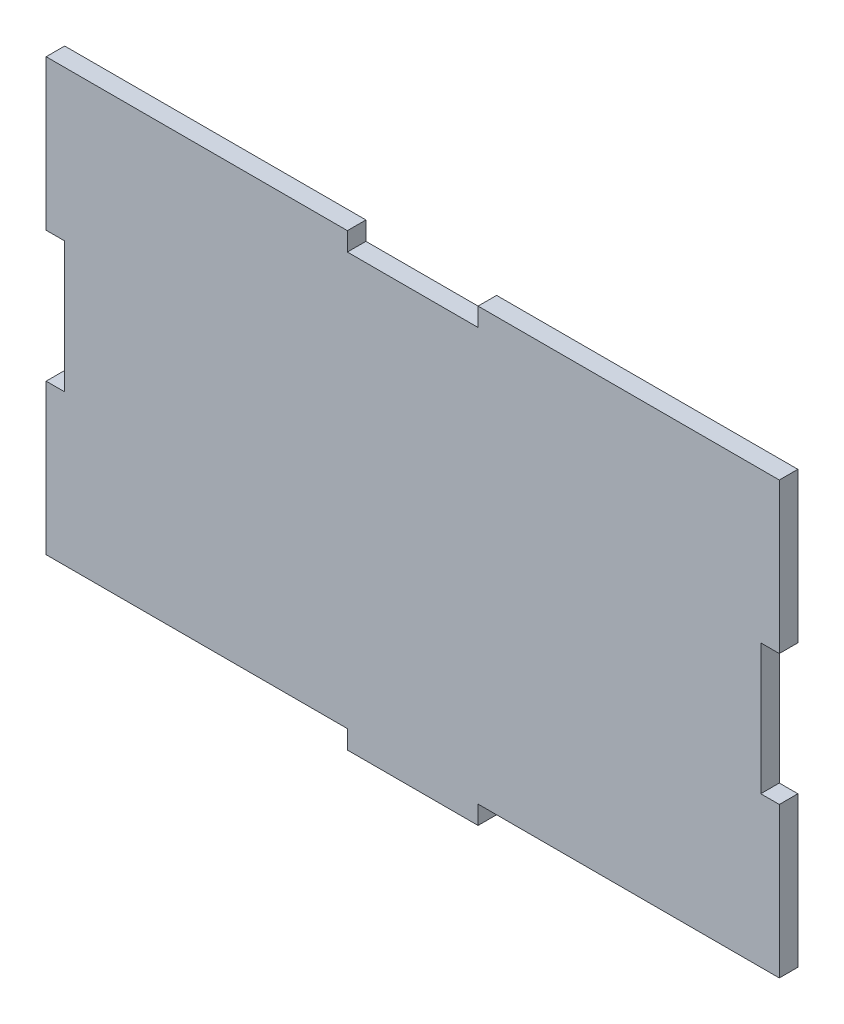
ISO-10303-21;
HEADER;
FILE_DESCRIPTION(('STEP AP214'),'2;1');
FILE_NAME('part.step','',(''),(''),'','','');
FILE_SCHEMA(('AUTOMOTIVE_DESIGN { 1 0 10303 214 1 1 1 1 }'));
ENDSEC;
DATA;
#1=APPLICATION_CONTEXT('core data for automotive mechanical design processes');
#2=APPLICATION_PROTOCOL_DEFINITION('international standard','automotive_design',2000,#1);
#3=PRODUCT_CONTEXT('',#1,'mechanical');
#4=PRODUCT('Part','Part','',(#3));
#5=PRODUCT_RELATED_PRODUCT_CATEGORY('part','',(#4));
#6=PRODUCT_DEFINITION_FORMATION('','',#4);
#7=PRODUCT_DEFINITION_CONTEXT('part definition',#1,'design');
#8=PRODUCT_DEFINITION('design','',#6,#7);
#9=PRODUCT_DEFINITION_SHAPE('','',#8);
#10=(LENGTH_UNIT() NAMED_UNIT(*) SI_UNIT(.MILLI.,.METRE.));
#11=(NAMED_UNIT(*) PLANE_ANGLE_UNIT() SI_UNIT($,.RADIAN.));
#12=(NAMED_UNIT(*) SI_UNIT($,.STERADIAN.) SOLID_ANGLE_UNIT());
#13=UNCERTAINTY_MEASURE_WITH_UNIT(LENGTH_MEASURE(1.E-05),#10,'distance_accuracy_value','');
#14=(GEOMETRIC_REPRESENTATION_CONTEXT(3) GLOBAL_UNCERTAINTY_ASSIGNED_CONTEXT((#13)) GLOBAL_UNIT_ASSIGNED_CONTEXT((#10,
#11,#12)) REPRESENTATION_CONTEXT('',''));
#15=CARTESIAN_POINT('',(0.,0.,0.));
#16=DIRECTION('',(0.,0.,1.));
#17=DIRECTION('',(1.,0.,0.));
#18=AXIS2_PLACEMENT_3D('',#15,#16,#17);
#19=CARTESIAN_POINT('',(85.,15.15,4.3));
#20=DIRECTION('',(-1.,0.,0.));
#21=DIRECTION('',(0.,-1.,0.));
#22=AXIS2_PLACEMENT_3D('',#19,#20,#21);
#23=PLANE('',#22);
#24=DIRECTION('',(0.,1.,0.));
#25=VECTOR('',#24,1.);
#26=CARTESIAN_POINT('',(85.,15.15,0.));
#27=LINE('',#26,#25);
#28=CARTESIAN_POINT('',(85.,15.15,0.));
#29=VERTEX_POINT('',#28);
#30=CARTESIAN_POINT('',(85.,50.,0.));
#31=VERTEX_POINT('',#30);
#32=EDGE_CURVE('E204',#29,#31,#27,.T.);
#33=ORIENTED_EDGE('',*,*,#32,.T.);
#34=DIRECTION('',(0.,0.,-1.));
#35=VECTOR('',#34,1.);
#36=CARTESIAN_POINT('',(85.,50.,4.3));
#37=LINE('',#36,#35);
#38=CARTESIAN_POINT('',(85.,50.,4.3));
#39=VERTEX_POINT('',#38);
#40=EDGE_CURVE('E11',#39,#31,#37,.T.);
#41=ORIENTED_EDGE('',*,*,#40,.F.);
#42=DIRECTION('',(0.,1.,0.));
#43=VECTOR('',#42,1.);
#44=CARTESIAN_POINT('',(85.,15.15,4.3));
#45=LINE('',#44,#43);
#46=CARTESIAN_POINT('',(85.,15.15,4.3));
#47=VERTEX_POINT('',#46);
#48=EDGE_CURVE('E242',#47,#39,#45,.T.);
#49=ORIENTED_EDGE('',*,*,#48,.F.);
#50=DIRECTION('',(0.,0.,-1.));
#51=VECTOR('',#50,1.);
#52=CARTESIAN_POINT('',(85.,15.15,4.3));
#53=LINE('',#52,#51);
#54=EDGE_CURVE('E200',#47,#29,#53,.T.);
#55=ORIENTED_EDGE('',*,*,#54,.T.);
#56=EDGE_LOOP('',(#33,#41,#49,#55));
#57=FACE_BOUND('',#56,.T.);
#58=ADVANCED_FACE('F36',(#57),#23,.F.);
#59=CARTESIAN_POINT('',(15.15,50.,4.3));
#60=DIRECTION('',(0.,-1.,0.));
#61=DIRECTION('',(0.,0.,-1.));
#62=AXIS2_PLACEMENT_3D('',#59,#60,#61);
#63=PLANE('',#62);
#64=DIRECTION('',(-1.,0.,0.));
#65=VECTOR('',#64,1.);
#66=CARTESIAN_POINT('',(15.15,50.,0.));
#67=LINE('',#66,#65);
#68=CARTESIAN_POINT('',(15.15,50.,0.));
#69=VERTEX_POINT('',#68);
#70=EDGE_CURVE('E207',#31,#69,#67,.T.);
#71=ORIENTED_EDGE('',*,*,#70,.T.);
#72=DIRECTION('',(0.,0.,-1.));
#73=VECTOR('',#72,1.);
#74=CARTESIAN_POINT('',(15.15,50.,4.3));
#75=LINE('',#74,#73);
#76=CARTESIAN_POINT('',(15.15,50.,4.3));
#77=VERTEX_POINT('',#76);
#78=EDGE_CURVE('E44',#77,#69,#75,.T.);
#79=ORIENTED_EDGE('',*,*,#78,.F.);
#80=DIRECTION('',(-1.,0.,0.));
#81=VECTOR('',#80,1.);
#82=CARTESIAN_POINT('',(15.15,50.,4.3));
#83=LINE('',#82,#81);
#84=EDGE_CURVE('E131',#39,#77,#83,.T.);
#85=ORIENTED_EDGE('',*,*,#84,.F.);
#86=ORIENTED_EDGE('',*,*,#40,.T.);
#87=EDGE_LOOP('',(#71,#79,#85,#86));
#88=FACE_BOUND('',#87,.T.);
#89=ADVANCED_FACE('F360',(#88),#63,.F.);
#90=CARTESIAN_POINT('',(15.15,50.,4.3));
#91=DIRECTION('',(1.,0.,0.));
#92=DIRECTION('',(0.,1.,0.));
#93=AXIS2_PLACEMENT_3D('',#90,#91,#92);
#94=PLANE('',#93);
#95=DIRECTION('',(0.,-1.,0.));
#96=VECTOR('',#95,1.);
#97=CARTESIAN_POINT('',(15.15,50.,0.));
#98=LINE('',#97,#96);
#99=CARTESIAN_POINT('',(15.15,45.7,0.));
#100=VERTEX_POINT('',#99);
#101=EDGE_CURVE('E209',#69,#100,#98,.T.);
#102=ORIENTED_EDGE('',*,*,#101,.T.);
#103=DIRECTION('',(0.,0.,-1.));
#104=VECTOR('',#103,1.);
#105=CARTESIAN_POINT('',(15.15,45.7,4.3));
#106=LINE('',#105,#104);
#107=CARTESIAN_POINT('',(15.15,45.7,4.3));
#108=VERTEX_POINT('',#107);
#109=EDGE_CURVE('E285',#108,#100,#106,.T.);
#110=ORIENTED_EDGE('',*,*,#109,.F.);
#111=DIRECTION('',(0.,-1.,0.));
#112=VECTOR('',#111,1.);
#113=CARTESIAN_POINT('',(15.15,50.,4.3));
#114=LINE('',#113,#112);
#115=EDGE_CURVE('E293',#77,#108,#114,.T.);
#116=ORIENTED_EDGE('',*,*,#115,.F.);
#117=ORIENTED_EDGE('',*,*,#78,.T.);
#118=EDGE_LOOP('',(#102,#110,#116,#117));
#119=FACE_BOUND('',#118,.T.);
#120=ADVANCED_FACE('F291',(#119),#94,.F.);
#121=CARTESIAN_POINT('',(-15.15,45.7,4.3));
#122=DIRECTION('',(0.,-1.,0.));
#123=DIRECTION('',(0.,0.,-1.));
#124=AXIS2_PLACEMENT_3D('',#121,#122,#123);
#125=PLANE('',#124);
#126=DIRECTION('',(-1.,0.,0.));
#127=VECTOR('',#126,1.);
#128=CARTESIAN_POINT('',(-15.15,45.7,0.));
#129=LINE('',#128,#127);
#130=CARTESIAN_POINT('',(-15.15,45.7,0.));
#131=VERTEX_POINT('',#130);
#132=EDGE_CURVE('E211',#100,#131,#129,.T.);
#133=ORIENTED_EDGE('',*,*,#132,.T.);
#134=DIRECTION('',(0.,0.,-1.));
#135=VECTOR('',#134,1.);
#136=CARTESIAN_POINT('',(-15.15,45.7,4.3));
#137=LINE('',#136,#135);
#138=CARTESIAN_POINT('',(-15.15,45.7,4.3));
#139=VERTEX_POINT('',#138);
#140=EDGE_CURVE('E282',#139,#131,#137,.T.);
#141=ORIENTED_EDGE('',*,*,#140,.F.);
#142=DIRECTION('',(-1.,0.,0.));
#143=VECTOR('',#142,1.);
#144=CARTESIAN_POINT('',(-15.15,45.7,4.3));
#145=LINE('',#144,#143);
#146=EDGE_CURVE('E311',#108,#139,#145,.T.);
#147=ORIENTED_EDGE('',*,*,#146,.F.);
#148=ORIENTED_EDGE('',*,*,#109,.T.);
#149=EDGE_LOOP('',(#133,#141,#147,#148));
#150=FACE_BOUND('',#149,.T.);
#151=ADVANCED_FACE('F302',(#150),#125,.F.);
#152=CARTESIAN_POINT('',(-15.15,50.,4.3));
#153=DIRECTION('',(-1.,0.,0.));
#154=DIRECTION('',(0.,-1.,0.));
#155=AXIS2_PLACEMENT_3D('',#152,#153,#154);
#156=PLANE('',#155);
#157=DIRECTION('',(0.,1.,0.));
#158=VECTOR('',#157,1.);
#159=CARTESIAN_POINT('',(-15.15,50.,0.));
#160=LINE('',#159,#158);
#161=CARTESIAN_POINT('',(-15.15,50.,0.));
#162=VERTEX_POINT('',#161);
#163=EDGE_CURVE('E213',#131,#162,#160,.T.);
#164=ORIENTED_EDGE('',*,*,#163,.T.);
#165=DIRECTION('',(0.,0.,-1.));
#166=VECTOR('',#165,1.);
#167=CARTESIAN_POINT('',(-15.15,50.,4.3));
#168=LINE('',#167,#166);
#169=CARTESIAN_POINT('',(-15.15,50.,4.3));
#170=VERTEX_POINT('',#169);
#171=EDGE_CURVE('E279',#170,#162,#168,.T.);
#172=ORIENTED_EDGE('',*,*,#171,.F.);
#173=DIRECTION('',(0.,1.,0.));
#174=VECTOR('',#173,1.);
#175=CARTESIAN_POINT('',(-15.15,50.,4.3));
#176=LINE('',#175,#174);
#177=EDGE_CURVE('E308',#139,#170,#176,.T.);
#178=ORIENTED_EDGE('',*,*,#177,.F.);
#179=ORIENTED_EDGE('',*,*,#140,.T.);
#180=EDGE_LOOP('',(#164,#172,#178,#179));
#181=FACE_BOUND('',#180,.T.);
#182=ADVANCED_FACE('F306',(#181),#156,.F.);
#183=CARTESIAN_POINT('',(-85.,50.,4.3));
#184=DIRECTION('',(0.,-1.,0.));
#185=DIRECTION('',(0.,0.,-1.));
#186=AXIS2_PLACEMENT_3D('',#183,#184,#185);
#187=PLANE('',#186);
#188=DIRECTION('',(-1.,0.,0.));
#189=VECTOR('',#188,1.);
#190=CARTESIAN_POINT('',(-85.,50.,0.));
#191=LINE('',#190,#189);
#192=CARTESIAN_POINT('',(-85.,50.,0.));
#193=VERTEX_POINT('',#192);
#194=EDGE_CURVE('E215',#162,#193,#191,.T.);
#195=ORIENTED_EDGE('',*,*,#194,.T.);
#196=DIRECTION('',(0.,0.,-1.));
#197=VECTOR('',#196,1.);
#198=CARTESIAN_POINT('',(-85.,50.,4.3));
#199=LINE('',#198,#197);
#200=CARTESIAN_POINT('',(-85.,50.,4.3));
#201=VERTEX_POINT('',#200);
#202=EDGE_CURVE('E276',#201,#193,#199,.T.);
#203=ORIENTED_EDGE('',*,*,#202,.F.);
#204=DIRECTION('',(-1.,0.,0.));
#205=VECTOR('',#204,1.);
#206=CARTESIAN_POINT('',(-85.,50.,4.3));
#207=LINE('',#206,#205);
#208=EDGE_CURVE('E310',#170,#201,#207,.T.);
#209=ORIENTED_EDGE('',*,*,#208,.F.);
#210=ORIENTED_EDGE('',*,*,#171,.T.);
#211=EDGE_LOOP('',(#195,#203,#209,#210));
#212=FACE_BOUND('',#211,.T.);
#213=ADVANCED_FACE('F373',(#212),#187,.F.);
#214=CARTESIAN_POINT('',(-85.,15.15,4.3));
#215=DIRECTION('',(1.,0.,0.));
#216=DIRECTION('',(0.,1.,0.));
#217=AXIS2_PLACEMENT_3D('',#214,#215,#216);
#218=PLANE('',#217);
#219=DIRECTION('',(0.,-1.,0.));
#220=VECTOR('',#219,1.);
#221=CARTESIAN_POINT('',(-85.,15.15,0.));
#222=LINE('',#221,#220);
#223=CARTESIAN_POINT('',(-85.,15.15,0.));
#224=VERTEX_POINT('',#223);
#225=EDGE_CURVE('E217',#193,#224,#222,.T.);
#226=ORIENTED_EDGE('',*,*,#225,.T.);
#227=DIRECTION('',(0.,0.,-1.));
#228=VECTOR('',#227,1.);
#229=CARTESIAN_POINT('',(-85.,15.15,4.3));
#230=LINE('',#229,#228);
#231=CARTESIAN_POINT('',(-85.,15.15,4.3));
#232=VERTEX_POINT('',#231);
#233=EDGE_CURVE('E273',#232,#224,#230,.T.);
#234=ORIENTED_EDGE('',*,*,#233,.F.);
#235=DIRECTION('',(0.,-1.,0.));
#236=VECTOR('',#235,1.);
#237=CARTESIAN_POINT('',(-85.,15.15,4.3));
#238=LINE('',#237,#236);
#239=EDGE_CURVE('E313',#201,#232,#238,.T.);
#240=ORIENTED_EDGE('',*,*,#239,.F.);
#241=ORIENTED_EDGE('',*,*,#202,.T.);
#242=EDGE_LOOP('',(#226,#234,#240,#241));
#243=FACE_BOUND('',#242,.T.);
#244=ADVANCED_FACE('F376',(#243),#218,.F.);
#245=CARTESIAN_POINT('',(-85.,15.15,4.3));
#246=DIRECTION('',(0.,1.,0.));
#247=DIRECTION('',(0.,0.,1.));
#248=AXIS2_PLACEMENT_3D('',#245,#246,#247);
#249=PLANE('',#248);
#250=DIRECTION('',(1.,0.,0.));
#251=VECTOR('',#250,1.);
#252=CARTESIAN_POINT('',(-85.,15.15,0.));
#253=LINE('',#252,#251);
#254=CARTESIAN_POINT('',(-80.7,15.15,0.));
#255=VERTEX_POINT('',#254);
#256=EDGE_CURVE('E219',#224,#255,#253,.T.);
#257=ORIENTED_EDGE('',*,*,#256,.T.);
#258=DIRECTION('',(0.,0.,-1.));
#259=VECTOR('',#258,1.);
#260=CARTESIAN_POINT('',(-80.7,15.15,4.3));
#261=LINE('',#260,#259);
#262=CARTESIAN_POINT('',(-80.7,15.15,4.3));
#263=VERTEX_POINT('',#262);
#264=EDGE_CURVE('E270',#263,#255,#261,.T.);
#265=ORIENTED_EDGE('',*,*,#264,.F.);
#266=DIRECTION('',(1.,0.,0.));
#267=VECTOR('',#266,1.);
#268=CARTESIAN_POINT('',(-85.,15.15,4.3));
#269=LINE('',#268,#267);
#270=EDGE_CURVE('E319',#232,#263,#269,.T.);
#271=ORIENTED_EDGE('',*,*,#270,.F.);
#272=ORIENTED_EDGE('',*,*,#233,.T.);
#273=EDGE_LOOP('',(#257,#265,#271,#272));
#274=FACE_BOUND('',#273,.T.);
#275=ADVANCED_FACE('F380',(#274),#249,.F.);
#276=CARTESIAN_POINT('',(-80.7,15.15,4.3));
#277=DIRECTION('',(1.,0.,0.));
#278=DIRECTION('',(0.,0.,-1.));
#279=AXIS2_PLACEMENT_3D('',#276,#277,#278);
#280=PLANE('',#279);
#281=DIRECTION('',(0.,-1.,0.));
#282=VECTOR('',#281,1.);
#283=CARTESIAN_POINT('',(-80.7,15.15,0.));
#284=LINE('',#283,#282);
#285=CARTESIAN_POINT('',(-80.7,-15.15,0.));
#286=VERTEX_POINT('',#285);
#287=EDGE_CURVE('E221',#255,#286,#284,.T.);
#288=ORIENTED_EDGE('',*,*,#287,.T.);
#289=DIRECTION('',(0.,0.,-1.));
#290=VECTOR('',#289,1.);
#291=CARTESIAN_POINT('',(-80.7,-15.15,4.3));
#292=LINE('',#291,#290);
#293=CARTESIAN_POINT('',(-80.7,-15.15,4.3));
#294=VERTEX_POINT('',#293);
#295=EDGE_CURVE('E267',#294,#286,#292,.T.);
#296=ORIENTED_EDGE('',*,*,#295,.F.);
#297=DIRECTION('',(0.,-1.,0.));
#298=VECTOR('',#297,1.);
#299=CARTESIAN_POINT('',(-80.7,15.15,4.3));
#300=LINE('',#299,#298);
#301=EDGE_CURVE('E321',#263,#294,#300,.T.);
#302=ORIENTED_EDGE('',*,*,#301,.F.);
#303=ORIENTED_EDGE('',*,*,#264,.T.);
#304=EDGE_LOOP('',(#288,#296,#302,#303));
#305=FACE_BOUND('',#304,.T.);
#306=ADVANCED_FACE('F384',(#305),#280,.F.);
#307=CARTESIAN_POINT('',(-85.,-15.15,4.3));
#308=DIRECTION('',(0.,-1.,0.));
#309=DIRECTION('',(0.,0.,-1.));
#310=AXIS2_PLACEMENT_3D('',#307,#308,#309);
#311=PLANE('',#310);
#312=DIRECTION('',(-1.,0.,0.));
#313=VECTOR('',#312,1.);
#314=CARTESIAN_POINT('',(-85.,-15.15,0.));
#315=LINE('',#314,#313);
#316=CARTESIAN_POINT('',(-85.,-15.15,0.));
#317=VERTEX_POINT('',#316);
#318=EDGE_CURVE('E223',#286,#317,#315,.T.);
#319=ORIENTED_EDGE('',*,*,#318,.T.);
#320=DIRECTION('',(0.,0.,-1.));
#321=VECTOR('',#320,1.);
#322=CARTESIAN_POINT('',(-85.,-15.15,4.3));
#323=LINE('',#322,#321);
#324=CARTESIAN_POINT('',(-85.,-15.15,4.3));
#325=VERTEX_POINT('',#324);
#326=EDGE_CURVE('E264',#325,#317,#323,.T.);
#327=ORIENTED_EDGE('',*,*,#326,.F.);
#328=DIRECTION('',(-1.,0.,0.));
#329=VECTOR('',#328,1.);
#330=CARTESIAN_POINT('',(-85.,-15.15,4.3));
#331=LINE('',#330,#329);
#332=EDGE_CURVE('E323',#294,#325,#331,.T.);
#333=ORIENTED_EDGE('',*,*,#332,.F.);
#334=ORIENTED_EDGE('',*,*,#295,.T.);
#335=EDGE_LOOP('',(#319,#327,#333,#334));
#336=FACE_BOUND('',#335,.T.);
#337=ADVANCED_FACE('F388',(#336),#311,.F.);
#338=CARTESIAN_POINT('',(-85.,-50.,4.3));
#339=DIRECTION('',(1.,0.,0.));
#340=DIRECTION('',(0.,1.,0.));
#341=AXIS2_PLACEMENT_3D('',#338,#339,#340);
#342=PLANE('',#341);
#343=DIRECTION('',(0.,-1.,0.));
#344=VECTOR('',#343,1.);
#345=CARTESIAN_POINT('',(-85.,-50.,0.));
#346=LINE('',#345,#344);
#347=CARTESIAN_POINT('',(-85.,-50.,0.));
#348=VERTEX_POINT('',#347);
#349=EDGE_CURVE('E225',#317,#348,#346,.T.);
#350=ORIENTED_EDGE('',*,*,#349,.T.);
#351=DIRECTION('',(0.,0.,-1.));
#352=VECTOR('',#351,1.);
#353=CARTESIAN_POINT('',(-85.,-50.,4.3));
#354=LINE('',#353,#352);
#355=CARTESIAN_POINT('',(-85.,-50.,4.3));
#356=VERTEX_POINT('',#355);
#357=EDGE_CURVE('E261',#356,#348,#354,.T.);
#358=ORIENTED_EDGE('',*,*,#357,.F.);
#359=DIRECTION('',(0.,-1.,0.));
#360=VECTOR('',#359,1.);
#361=CARTESIAN_POINT('',(-85.,-50.,4.3));
#362=LINE('',#361,#360);
#363=EDGE_CURVE('E325',#325,#356,#362,.T.);
#364=ORIENTED_EDGE('',*,*,#363,.F.);
#365=ORIENTED_EDGE('',*,*,#326,.T.);
#366=EDGE_LOOP('',(#350,#358,#364,#365));
#367=FACE_BOUND('',#366,.T.);
#368=ADVANCED_FACE('F392',(#367),#342,.F.);
#369=CARTESIAN_POINT('',(-85.,-50.,4.3));
#370=DIRECTION('',(0.,1.,0.));
#371=DIRECTION('',(-1.,0.,0.));
#372=AXIS2_PLACEMENT_3D('',#369,#370,#371);
#373=PLANE('',#372);
#374=DIRECTION('',(1.,0.,0.));
#375=VECTOR('',#374,1.);
#376=CARTESIAN_POINT('',(-85.,-50.,0.));
#377=LINE('',#376,#375);
#378=CARTESIAN_POINT('',(-15.15,-50.,0.));
#379=VERTEX_POINT('',#378);
#380=EDGE_CURVE('E227',#348,#379,#377,.T.);
#381=ORIENTED_EDGE('',*,*,#380,.T.);
#382=DIRECTION('',(0.,0.,-1.));
#383=VECTOR('',#382,1.);
#384=CARTESIAN_POINT('',(-15.15,-50.,4.3));
#385=LINE('',#384,#383);
#386=CARTESIAN_POINT('',(-15.15,-50.,4.3));
#387=VERTEX_POINT('',#386);
#388=EDGE_CURVE('E258',#387,#379,#385,.T.);
#389=ORIENTED_EDGE('',*,*,#388,.F.);
#390=DIRECTION('',(1.,0.,0.));
#391=VECTOR('',#390,1.);
#392=CARTESIAN_POINT('',(-85.,-50.,4.3));
#393=LINE('',#392,#391);
#394=EDGE_CURVE('E327',#356,#387,#393,.T.);
#395=ORIENTED_EDGE('',*,*,#394,.F.);
#396=ORIENTED_EDGE('',*,*,#357,.T.);
#397=EDGE_LOOP('',(#381,#389,#395,#396));
#398=FACE_BOUND('',#397,.T.);
#399=ADVANCED_FACE('F396',(#398),#373,.F.);
#400=CARTESIAN_POINT('',(-15.15,-50.,4.3));
#401=DIRECTION('',(1.,0.,0.));
#402=DIRECTION('',(0.,0.,-1.));
#403=AXIS2_PLACEMENT_3D('',#400,#401,#402);
#404=PLANE('',#403);
#405=DIRECTION('',(0.,-1.,0.));
#406=VECTOR('',#405,1.);
#407=CARTESIAN_POINT('',(-15.15,-50.,0.));
#408=LINE('',#407,#406);
#409=CARTESIAN_POINT('',(-15.15,-54.3,0.));
#410=VERTEX_POINT('',#409);
#411=EDGE_CURVE('E229',#379,#410,#408,.T.);
#412=ORIENTED_EDGE('',*,*,#411,.T.);
#413=DIRECTION('',(0.,0.,-1.));
#414=VECTOR('',#413,1.);
#415=CARTESIAN_POINT('',(-15.15,-54.3,4.3));
#416=LINE('',#415,#414);
#417=CARTESIAN_POINT('',(-15.15,-54.3,4.3));
#418=VERTEX_POINT('',#417);
#419=EDGE_CURVE('E255',#418,#410,#416,.T.);
#420=ORIENTED_EDGE('',*,*,#419,.F.);
#421=DIRECTION('',(0.,-1.,0.));
#422=VECTOR('',#421,1.);
#423=CARTESIAN_POINT('',(-15.15,-50.,4.3));
#424=LINE('',#423,#422);
#425=EDGE_CURVE('E329',#387,#418,#424,.T.);
#426=ORIENTED_EDGE('',*,*,#425,.F.);
#427=ORIENTED_EDGE('',*,*,#388,.T.);
#428=EDGE_LOOP('',(#412,#420,#426,#427));
#429=FACE_BOUND('',#428,.T.);
#430=ADVANCED_FACE('F400',(#429),#404,.F.);
#431=CARTESIAN_POINT('',(15.15,-54.3,4.3));
#432=DIRECTION('',(0.,1.,0.));
#433=DIRECTION('',(0.,0.,1.));
#434=AXIS2_PLACEMENT_3D('',#431,#432,#433);
#435=PLANE('',#434);
#436=DIRECTION('',(1.,0.,0.));
#437=VECTOR('',#436,1.);
#438=CARTESIAN_POINT('',(15.15,-54.3,0.));
#439=LINE('',#438,#437);
#440=CARTESIAN_POINT('',(15.15,-54.3,0.));
#441=VERTEX_POINT('',#440);
#442=EDGE_CURVE('E231',#410,#441,#439,.T.);
#443=ORIENTED_EDGE('',*,*,#442,.T.);
#444=DIRECTION('',(0.,0.,-1.));
#445=VECTOR('',#444,1.);
#446=CARTESIAN_POINT('',(15.15,-54.3,4.3));
#447=LINE('',#446,#445);
#448=CARTESIAN_POINT('',(15.15,-54.3,4.3));
#449=VERTEX_POINT('',#448);
#450=EDGE_CURVE('E252',#449,#441,#447,.T.);
#451=ORIENTED_EDGE('',*,*,#450,.F.);
#452=DIRECTION('',(1.,0.,0.));
#453=VECTOR('',#452,1.);
#454=CARTESIAN_POINT('',(15.15,-54.3,4.3));
#455=LINE('',#454,#453);
#456=EDGE_CURVE('E331',#418,#449,#455,.T.);
#457=ORIENTED_EDGE('',*,*,#456,.F.);
#458=ORIENTED_EDGE('',*,*,#419,.T.);
#459=EDGE_LOOP('',(#443,#451,#457,#458));
#460=FACE_BOUND('',#459,.T.);
#461=ADVANCED_FACE('F404',(#460),#435,.F.);
#462=CARTESIAN_POINT('',(15.15,-50.,4.3));
#463=DIRECTION('',(-1.,0.,0.));
#464=DIRECTION('',(0.,0.,1.));
#465=AXIS2_PLACEMENT_3D('',#462,#463,#464);
#466=PLANE('',#465);
#467=DIRECTION('',(0.,1.,0.));
#468=VECTOR('',#467,1.);
#469=CARTESIAN_POINT('',(15.15,-50.,0.));
#470=LINE('',#469,#468);
#471=CARTESIAN_POINT('',(15.15,-50.,0.));
#472=VERTEX_POINT('',#471);
#473=EDGE_CURVE('E233',#441,#472,#470,.T.);
#474=ORIENTED_EDGE('',*,*,#473,.T.);
#475=DIRECTION('',(0.,0.,-1.));
#476=VECTOR('',#475,1.);
#477=CARTESIAN_POINT('',(15.15,-50.,4.3));
#478=LINE('',#477,#476);
#479=CARTESIAN_POINT('',(15.15,-50.,4.3));
#480=VERTEX_POINT('',#479);
#481=EDGE_CURVE('E249',#480,#472,#478,.T.);
#482=ORIENTED_EDGE('',*,*,#481,.F.);
#483=DIRECTION('',(0.,1.,0.));
#484=VECTOR('',#483,1.);
#485=CARTESIAN_POINT('',(15.15,-50.,4.3));
#486=LINE('',#485,#484);
#487=EDGE_CURVE('E333',#449,#480,#486,.T.);
#488=ORIENTED_EDGE('',*,*,#487,.F.);
#489=ORIENTED_EDGE('',*,*,#450,.T.);
#490=EDGE_LOOP('',(#474,#482,#488,#489));
#491=FACE_BOUND('',#490,.T.);
#492=ADVANCED_FACE('F408',(#491),#466,.F.);
#493=CARTESIAN_POINT('',(15.15,-50.,4.3));
#494=DIRECTION('',(0.,1.,0.));
#495=DIRECTION('',(-1.,0.,0.));
#496=AXIS2_PLACEMENT_3D('',#493,#494,#495);
#497=PLANE('',#496);
#498=DIRECTION('',(1.,0.,0.));
#499=VECTOR('',#498,1.);
#500=CARTESIAN_POINT('',(15.15,-50.,0.));
#501=LINE('',#500,#499);
#502=CARTESIAN_POINT('',(85.,-50.,0.));
#503=VERTEX_POINT('',#502);
#504=EDGE_CURVE('E235',#472,#503,#501,.T.);
#505=ORIENTED_EDGE('',*,*,#504,.T.);
#506=DIRECTION('',(0.,0.,-1.));
#507=VECTOR('',#506,1.);
#508=CARTESIAN_POINT('',(85.,-50.,4.3));
#509=LINE('',#508,#507);
#510=CARTESIAN_POINT('',(85.,-50.,4.3));
#511=VERTEX_POINT('',#510);
#512=EDGE_CURVE('E246',#511,#503,#509,.T.);
#513=ORIENTED_EDGE('',*,*,#512,.F.);
#514=DIRECTION('',(1.,0.,0.));
#515=VECTOR('',#514,1.);
#516=CARTESIAN_POINT('',(15.15,-50.,4.3));
#517=LINE('',#516,#515);
#518=EDGE_CURVE('E335',#480,#511,#517,.T.);
#519=ORIENTED_EDGE('',*,*,#518,.F.);
#520=ORIENTED_EDGE('',*,*,#481,.T.);
#521=EDGE_LOOP('',(#505,#513,#519,#520));
#522=FACE_BOUND('',#521,.T.);
#523=ADVANCED_FACE('F341',(#522),#497,.F.);
#524=CARTESIAN_POINT('',(85.,-50.,4.3));
#525=DIRECTION('',(-1.,0.,0.));
#526=DIRECTION('',(0.,-1.,0.));
#527=AXIS2_PLACEMENT_3D('',#524,#525,#526);
#528=PLANE('',#527);
#529=DIRECTION('',(0.,1.,0.));
#530=VECTOR('',#529,1.);
#531=CARTESIAN_POINT('',(85.,-50.,0.));
#532=LINE('',#531,#530);
#533=CARTESIAN_POINT('',(85.,-15.15,0.));
#534=VERTEX_POINT('',#533);
#535=EDGE_CURVE('E237',#503,#534,#532,.T.);
#536=ORIENTED_EDGE('',*,*,#535,.T.);
#537=DIRECTION('',(0.,0.,-1.));
#538=VECTOR('',#537,1.);
#539=CARTESIAN_POINT('',(85.,-15.15,4.3));
#540=LINE('',#539,#538);
#541=CARTESIAN_POINT('',(85.,-15.15,4.3));
#542=VERTEX_POINT('',#541);
#543=EDGE_CURVE('E195',#542,#534,#540,.T.);
#544=ORIENTED_EDGE('',*,*,#543,.F.);
#545=DIRECTION('',(0.,1.,0.));
#546=VECTOR('',#545,1.);
#547=CARTESIAN_POINT('',(85.,-50.,4.3));
#548=LINE('',#547,#546);
#549=EDGE_CURVE('E186',#511,#542,#548,.T.);
#550=ORIENTED_EDGE('',*,*,#549,.F.);
#551=ORIENTED_EDGE('',*,*,#512,.T.);
#552=EDGE_LOOP('',(#536,#544,#550,#551));
#553=FACE_BOUND('',#552,.T.);
#554=ADVANCED_FACE('F345',(#553),#528,.F.);
#555=CARTESIAN_POINT('',(85.,-15.15,4.3));
#556=DIRECTION('',(0.,-1.,0.));
#557=DIRECTION('',(0.,0.,-1.));
#558=AXIS2_PLACEMENT_3D('',#555,#556,#557);
#559=PLANE('',#558);
#560=DIRECTION('',(-1.,0.,0.));
#561=VECTOR('',#560,1.);
#562=CARTESIAN_POINT('',(85.,-15.15,0.));
#563=LINE('',#562,#561);
#564=CARTESIAN_POINT('',(80.7,-15.15,0.));
#565=VERTEX_POINT('',#564);
#566=EDGE_CURVE('E194',#534,#565,#563,.T.);
#567=ORIENTED_EDGE('',*,*,#566,.T.);
#568=DIRECTION('',(0.,0.,-1.));
#569=VECTOR('',#568,1.);
#570=CARTESIAN_POINT('',(80.7,-15.15,4.3));
#571=LINE('',#570,#569);
#572=CARTESIAN_POINT('',(80.7,-15.15,4.3));
#573=VERTEX_POINT('',#572);
#574=EDGE_CURVE('E191',#573,#565,#571,.T.);
#575=ORIENTED_EDGE('',*,*,#574,.F.);
#576=DIRECTION('',(-1.,0.,0.));
#577=VECTOR('',#576,1.);
#578=CARTESIAN_POINT('',(85.,-15.15,4.3));
#579=LINE('',#578,#577);
#580=EDGE_CURVE('E180',#542,#573,#579,.T.);
#581=ORIENTED_EDGE('',*,*,#580,.F.);
#582=ORIENTED_EDGE('',*,*,#543,.T.);
#583=EDGE_LOOP('',(#567,#575,#581,#582));
#584=FACE_BOUND('',#583,.T.);
#585=ADVANCED_FACE('F192',(#584),#559,.F.);
#586=CARTESIAN_POINT('',(80.7,15.15,4.3));
#587=DIRECTION('',(-1.,0.,0.));
#588=DIRECTION('',(0.,0.,1.));
#589=AXIS2_PLACEMENT_3D('',#586,#587,#588);
#590=PLANE('',#589);
#591=DIRECTION('',(0.,1.,0.));
#592=VECTOR('',#591,1.);
#593=CARTESIAN_POINT('',(80.7,15.15,0.));
#594=LINE('',#593,#592);
#595=CARTESIAN_POINT('',(80.7,15.15,0.));
#596=VERTEX_POINT('',#595);
#597=EDGE_CURVE('E117',#565,#596,#594,.T.);
#598=ORIENTED_EDGE('',*,*,#597,.T.);
#599=DIRECTION('',(0.,0.,-1.));
#600=VECTOR('',#599,1.);
#601=CARTESIAN_POINT('',(80.7,15.15,4.3));
#602=LINE('',#601,#600);
#603=CARTESIAN_POINT('',(80.7,15.15,4.3));
#604=VERTEX_POINT('',#603);
#605=EDGE_CURVE('E196',#604,#596,#602,.T.);
#606=ORIENTED_EDGE('',*,*,#605,.F.);
#607=DIRECTION('',(0.,1.,0.));
#608=VECTOR('',#607,1.);
#609=CARTESIAN_POINT('',(80.7,15.15,4.3));
#610=LINE('',#609,#608);
#611=EDGE_CURVE('E184',#573,#604,#610,.T.);
#612=ORIENTED_EDGE('',*,*,#611,.F.);
#613=ORIENTED_EDGE('',*,*,#574,.T.);
#614=EDGE_LOOP('',(#598,#606,#612,#613));
#615=FACE_BOUND('',#614,.T.);
#616=ADVANCED_FACE('F198',(#615),#590,.F.);
#617=CARTESIAN_POINT('',(85.,15.15,4.3));
#618=DIRECTION('',(0.,1.,0.));
#619=DIRECTION('',(0.,0.,1.));
#620=AXIS2_PLACEMENT_3D('',#617,#618,#619);
#621=PLANE('',#620);
#622=DIRECTION('',(1.,0.,0.));
#623=VECTOR('',#622,1.);
#624=CARTESIAN_POINT('',(85.,15.15,0.));
#625=LINE('',#624,#623);
#626=EDGE_CURVE('E123',#596,#29,#625,.T.);
#627=ORIENTED_EDGE('',*,*,#626,.T.);
#628=ORIENTED_EDGE('',*,*,#54,.F.);
#629=DIRECTION('',(1.,0.,0.));
#630=VECTOR('',#629,1.);
#631=CARTESIAN_POINT('',(85.,15.15,4.3));
#632=LINE('',#631,#630);
#633=EDGE_CURVE('E52',#604,#47,#632,.T.);
#634=ORIENTED_EDGE('',*,*,#633,.F.);
#635=ORIENTED_EDGE('',*,*,#605,.T.);
#636=EDGE_LOOP('',(#627,#628,#634,#635));
#637=FACE_BOUND('',#636,.T.);
#638=ADVANCED_FACE('F349',(#637),#621,.F.);
#639=CARTESIAN_POINT('',(0.,0.,4.3));
#640=DIRECTION('',(0.,0.,-1.));
#641=DIRECTION('',(-1.,0.,0.));
#642=AXIS2_PLACEMENT_3D('',#639,#640,#641);
#643=PLANE('',#642);
#644=ORIENTED_EDGE('',*,*,#48,.T.);
#645=ORIENTED_EDGE('',*,*,#84,.T.);
#646=ORIENTED_EDGE('',*,*,#115,.T.);
#647=ORIENTED_EDGE('',*,*,#146,.T.);
#648=ORIENTED_EDGE('',*,*,#177,.T.);
#649=ORIENTED_EDGE('',*,*,#208,.T.);
#650=ORIENTED_EDGE('',*,*,#239,.T.);
#651=ORIENTED_EDGE('',*,*,#270,.T.);
#652=ORIENTED_EDGE('',*,*,#301,.T.);
#653=ORIENTED_EDGE('',*,*,#332,.T.);
#654=ORIENTED_EDGE('',*,*,#363,.T.);
#655=ORIENTED_EDGE('',*,*,#394,.T.);
#656=ORIENTED_EDGE('',*,*,#425,.T.);
#657=ORIENTED_EDGE('',*,*,#456,.T.);
#658=ORIENTED_EDGE('',*,*,#487,.T.);
#659=ORIENTED_EDGE('',*,*,#518,.T.);
#660=ORIENTED_EDGE('',*,*,#549,.T.);
#661=ORIENTED_EDGE('',*,*,#580,.T.);
#662=ORIENTED_EDGE('',*,*,#611,.T.);
#663=ORIENTED_EDGE('',*,*,#633,.T.);
#664=EDGE_LOOP('',(#644,#645,#646,#647,#648,#649,#650,#651,#652,#653,#654,#655,#656,#657,#658,
#659,#660,#661,#662,#663));
#665=FACE_BOUND('',#664,.T.);
#666=ADVANCED_FACE('F182',(#665),#643,.F.);
#667=CARTESIAN_POINT('',(0.,0.,0.));
#668=DIRECTION('',(0.,0.,-1.));
#669=DIRECTION('',(-1.,0.,0.));
#670=AXIS2_PLACEMENT_3D('',#667,#668,#669);
#671=PLANE('',#670);
#672=ORIENTED_EDGE('',*,*,#32,.F.);
#673=ORIENTED_EDGE('',*,*,#626,.F.);
#674=ORIENTED_EDGE('',*,*,#597,.F.);
#675=ORIENTED_EDGE('',*,*,#566,.F.);
#676=ORIENTED_EDGE('',*,*,#535,.F.);
#677=ORIENTED_EDGE('',*,*,#504,.F.);
#678=ORIENTED_EDGE('',*,*,#473,.F.);
#679=ORIENTED_EDGE('',*,*,#442,.F.);
#680=ORIENTED_EDGE('',*,*,#411,.F.);
#681=ORIENTED_EDGE('',*,*,#380,.F.);
#682=ORIENTED_EDGE('',*,*,#349,.F.);
#683=ORIENTED_EDGE('',*,*,#318,.F.);
#684=ORIENTED_EDGE('',*,*,#287,.F.);
#685=ORIENTED_EDGE('',*,*,#256,.F.);
#686=ORIENTED_EDGE('',*,*,#225,.F.);
#687=ORIENTED_EDGE('',*,*,#194,.F.);
#688=ORIENTED_EDGE('',*,*,#163,.F.);
#689=ORIENTED_EDGE('',*,*,#132,.F.);
#690=ORIENTED_EDGE('',*,*,#101,.F.);
#691=ORIENTED_EDGE('',*,*,#70,.F.);
#692=EDGE_LOOP('',(#672,#673,#674,#675,#676,#677,#678,#679,#680,#681,#682,#683,#684,#685,#686,
#687,#688,#689,#690,#691));
#693=FACE_BOUND('',#692,.T.);
#694=ADVANCED_FACE('F297',(#693),#671,.T.);
#695=CLOSED_SHELL('',(#58,#89,#120,#151,#182,#213,#244,#275,#306,#337,#368,#399,#430,#461,#492,
#523,#554,#585,#616,#638,#666,#694));
#696=MANIFOLD_SOLID_BREP('B2',#695);
#697=ADVANCED_BREP_SHAPE_REPRESENTATION('',(#18,#696),#14);
#698=SHAPE_DEFINITION_REPRESENTATION(#9,#697);
ENDSEC;
END-ISO-10303-21;
